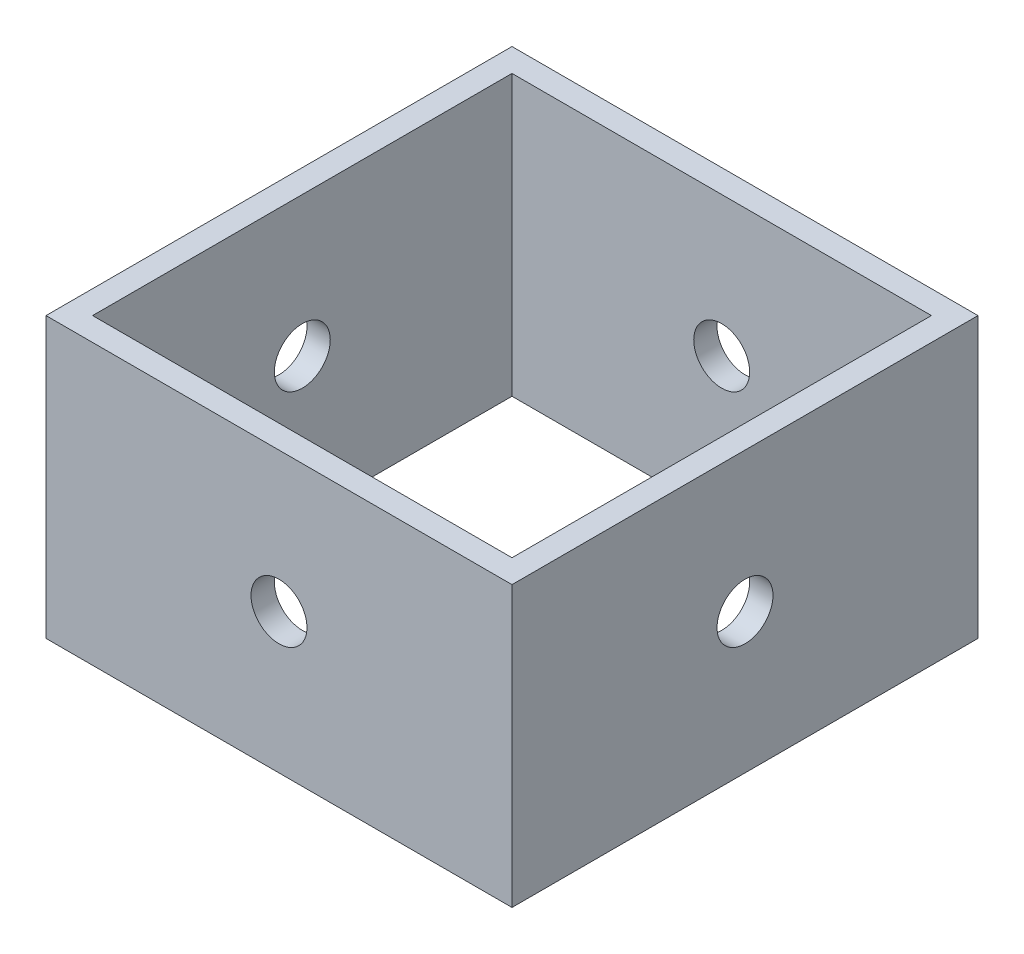
ISO-10303-21;
HEADER;
FILE_DESCRIPTION(('STEP AP214'),'2;1');
FILE_NAME('part.step','',(''),(''),'','','');
FILE_SCHEMA(('AUTOMOTIVE_DESIGN { 1 0 10303 214 1 1 1 1 }'));
ENDSEC;
DATA;
#1=APPLICATION_CONTEXT('core data for automotive mechanical design processes');
#2=APPLICATION_PROTOCOL_DEFINITION('international standard','automotive_design',2000,#1);
#3=PRODUCT_CONTEXT('',#1,'mechanical');
#4=PRODUCT('Part','Part','',(#3));
#5=PRODUCT_RELATED_PRODUCT_CATEGORY('part','',(#4));
#6=PRODUCT_DEFINITION_FORMATION('','',#4);
#7=PRODUCT_DEFINITION_CONTEXT('part definition',#1,'design');
#8=PRODUCT_DEFINITION('design','',#6,#7);
#9=PRODUCT_DEFINITION_SHAPE('','',#8);
#10=(LENGTH_UNIT() NAMED_UNIT(*) SI_UNIT(.MILLI.,.METRE.));
#11=(NAMED_UNIT(*) PLANE_ANGLE_UNIT() SI_UNIT($,.RADIAN.));
#12=(NAMED_UNIT(*) SI_UNIT($,.STERADIAN.) SOLID_ANGLE_UNIT());
#13=UNCERTAINTY_MEASURE_WITH_UNIT(LENGTH_MEASURE(1.E-05),#10,'distance_accuracy_value','');
#14=(GEOMETRIC_REPRESENTATION_CONTEXT(3) GLOBAL_UNCERTAINTY_ASSIGNED_CONTEXT((#13)) GLOBAL_UNIT_ASSIGNED_CONTEXT((#10,
#11,#12)) REPRESENTATION_CONTEXT('',''));
#15=CARTESIAN_POINT('',(0.,0.,0.));
#16=DIRECTION('',(0.,0.,1.));
#17=DIRECTION('',(1.,0.,0.));
#18=AXIS2_PLACEMENT_3D('',#15,#16,#17);
#19=CARTESIAN_POINT('',(0.,15.,0.));
#20=DIRECTION('',(0.,1.,0.));
#21=DIRECTION('',(0.,0.,1.));
#22=AXIS2_PLACEMENT_3D('',#19,#20,#21);
#23=PLANE('',#22);
#24=DIRECTION('',(0.,0.,-1.));
#25=VECTOR('',#24,1.);
#26=CARTESIAN_POINT('',(12.5,15.,-12.5));
#27=LINE('',#26,#25);
#28=CARTESIAN_POINT('',(12.5,15.,12.5));
#29=VERTEX_POINT('',#28);
#30=CARTESIAN_POINT('',(12.5,15.,-12.5));
#31=VERTEX_POINT('',#30);
#32=EDGE_CURVE('E140',#29,#31,#27,.T.);
#33=ORIENTED_EDGE('',*,*,#32,.T.);
#34=DIRECTION('',(-1.,0.,0.));
#35=VECTOR('',#34,1.);
#36=CARTESIAN_POINT('',(-12.5,15.,-12.5));
#37=LINE('',#36,#35);
#38=CARTESIAN_POINT('',(-12.5,15.,-12.5));
#39=VERTEX_POINT('',#38);
#40=EDGE_CURVE('E143',#31,#39,#37,.T.);
#41=ORIENTED_EDGE('',*,*,#40,.T.);
#42=DIRECTION('',(0.,0.,1.));
#43=VECTOR('',#42,1.);
#44=CARTESIAN_POINT('',(-12.5,15.,-12.5));
#45=LINE('',#44,#43);
#46=CARTESIAN_POINT('',(-12.5,15.,12.5));
#47=VERTEX_POINT('',#46);
#48=EDGE_CURVE('E146',#39,#47,#45,.T.);
#49=ORIENTED_EDGE('',*,*,#48,.T.);
#50=DIRECTION('',(1.,0.,0.));
#51=VECTOR('',#50,1.);
#52=CARTESIAN_POINT('',(-12.5,15.,12.5));
#53=LINE('',#52,#51);
#54=EDGE_CURVE('E148',#47,#29,#53,.T.);
#55=ORIENTED_EDGE('',*,*,#54,.T.);
#56=EDGE_LOOP('',(#33,#41,#49,#55));
#57=FACE_BOUND('',#56,.T.);
#58=DIRECTION('',(1.,0.,0.));
#59=VECTOR('',#58,1.);
#60=CARTESIAN_POINT('',(11.2504266533904,15.,11.2504266533904));
#61=LINE('',#60,#59);
#62=CARTESIAN_POINT('',(-11.2504266533904,15.,11.2504266533904));
#63=VERTEX_POINT('',#62);
#64=CARTESIAN_POINT('',(11.2504266533904,15.,11.2504266533904));
#65=VERTEX_POINT('',#64);
#66=EDGE_CURVE('E110',#63,#65,#61,.T.);
#67=ORIENTED_EDGE('',*,*,#66,.F.);
#68=DIRECTION('',(0.,0.,1.));
#69=VECTOR('',#68,1.);
#70=CARTESIAN_POINT('',(-11.2504266533904,15.,-11.2504266533904));
#71=LINE('',#70,#69);
#72=CARTESIAN_POINT('',(-11.2504266533904,15.,-11.2504266533904));
#73=VERTEX_POINT('',#72);
#74=EDGE_CURVE('E102',#73,#63,#71,.T.);
#75=ORIENTED_EDGE('',*,*,#74,.F.);
#76=DIRECTION('',(-1.,0.,0.));
#77=VECTOR('',#76,1.);
#78=CARTESIAN_POINT('',(11.2504266533904,15.,-11.2504266533904));
#79=LINE('',#78,#77);
#80=CARTESIAN_POINT('',(11.2504266533904,15.,-11.2504266533904));
#81=VERTEX_POINT('',#80);
#82=EDGE_CURVE('E124',#81,#73,#79,.T.);
#83=ORIENTED_EDGE('',*,*,#82,.F.);
#84=DIRECTION('',(0.,0.,-1.));
#85=VECTOR('',#84,1.);
#86=CARTESIAN_POINT('',(11.2504266533904,15.,-11.2504266533904));
#87=LINE('',#86,#85);
#88=EDGE_CURVE('E122',#65,#81,#87,.T.);
#89=ORIENTED_EDGE('',*,*,#88,.F.);
#90=EDGE_LOOP('',(#67,#75,#83,#89));
#91=FACE_BOUND('',#90,.T.);
#92=ADVANCED_FACE('F35',(#57,#91),#23,.T.);
#93=CARTESIAN_POINT('',(0.,0.,0.));
#94=DIRECTION('',(0.,1.,0.));
#95=DIRECTION('',(0.,0.,1.));
#96=AXIS2_PLACEMENT_3D('',#93,#94,#95);
#97=PLANE('',#96);
#98=DIRECTION('',(0.,0.,-1.));
#99=VECTOR('',#98,1.);
#100=CARTESIAN_POINT('',(12.5,0.,-12.5));
#101=LINE('',#100,#99);
#102=CARTESIAN_POINT('',(12.5,0.,12.5));
#103=VERTEX_POINT('',#102);
#104=CARTESIAN_POINT('',(12.5,0.,-12.5));
#105=VERTEX_POINT('',#104);
#106=EDGE_CURVE('E118',#103,#105,#101,.T.);
#107=ORIENTED_EDGE('',*,*,#106,.F.);
#108=DIRECTION('',(1.,0.,0.));
#109=VECTOR('',#108,1.);
#110=CARTESIAN_POINT('',(-12.5,0.,12.5));
#111=LINE('',#110,#109);
#112=CARTESIAN_POINT('',(-12.5,0.,12.5));
#113=VERTEX_POINT('',#112);
#114=EDGE_CURVE('E144',#113,#103,#111,.T.);
#115=ORIENTED_EDGE('',*,*,#114,.F.);
#116=DIRECTION('',(0.,0.,1.));
#117=VECTOR('',#116,1.);
#118=CARTESIAN_POINT('',(-12.5,0.,-12.5));
#119=LINE('',#118,#117);
#120=CARTESIAN_POINT('',(-12.5,0.,-12.5));
#121=VERTEX_POINT('',#120);
#122=EDGE_CURVE('E155',#121,#113,#119,.T.);
#123=ORIENTED_EDGE('',*,*,#122,.F.);
#124=DIRECTION('',(-1.,0.,0.));
#125=VECTOR('',#124,1.);
#126=CARTESIAN_POINT('',(-12.5,0.,-12.5));
#127=LINE('',#126,#125);
#128=EDGE_CURVE('E153',#105,#121,#127,.T.);
#129=ORIENTED_EDGE('',*,*,#128,.F.);
#130=EDGE_LOOP('',(#107,#115,#123,#129));
#131=FACE_BOUND('',#130,.T.);
#132=DIRECTION('',(0.,0.,1.));
#133=VECTOR('',#132,1.);
#134=CARTESIAN_POINT('',(-11.2504266533904,0.,-11.2504266533904));
#135=LINE('',#134,#133);
#136=CARTESIAN_POINT('',(-11.2504266533904,0.,-11.2504266533904));
#137=VERTEX_POINT('',#136);
#138=CARTESIAN_POINT('',(-11.2504266533904,0.,11.2504266533904));
#139=VERTEX_POINT('',#138);
#140=EDGE_CURVE('E60',#137,#139,#135,.T.);
#141=ORIENTED_EDGE('',*,*,#140,.T.);
#142=DIRECTION('',(1.,0.,0.));
#143=VECTOR('',#142,1.);
#144=CARTESIAN_POINT('',(11.2504266533904,0.,11.2504266533904));
#145=LINE('',#144,#143);
#146=CARTESIAN_POINT('',(11.2504266533904,0.,11.2504266533904));
#147=VERTEX_POINT('',#146);
#148=EDGE_CURVE('E117',#139,#147,#145,.T.);
#149=ORIENTED_EDGE('',*,*,#148,.T.);
#150=DIRECTION('',(0.,0.,-1.));
#151=VECTOR('',#150,1.);
#152=CARTESIAN_POINT('',(11.2504266533904,0.,-11.2504266533904));
#153=LINE('',#152,#151);
#154=CARTESIAN_POINT('',(11.2504266533904,0.,-11.2504266533904));
#155=VERTEX_POINT('',#154);
#156=EDGE_CURVE('E132',#147,#155,#153,.T.);
#157=ORIENTED_EDGE('',*,*,#156,.T.);
#158=DIRECTION('',(-1.,0.,0.));
#159=VECTOR('',#158,1.);
#160=CARTESIAN_POINT('',(11.2504266533904,0.,-11.2504266533904));
#161=LINE('',#160,#159);
#162=EDGE_CURVE('E111',#155,#137,#161,.T.);
#163=ORIENTED_EDGE('',*,*,#162,.T.);
#164=EDGE_LOOP('',(#141,#149,#157,#163));
#165=FACE_BOUND('',#164,.T.);
#166=ADVANCED_FACE('F201',(#131,#165),#97,.F.);
#167=CARTESIAN_POINT('',(12.5,15.,-12.5));
#168=DIRECTION('',(-1.,0.,0.));
#169=DIRECTION('',(0.,0.,1.));
#170=AXIS2_PLACEMENT_3D('',#167,#168,#169);
#171=PLANE('',#170);
#172=CARTESIAN_POINT('',(12.5,7.5,0.));
#173=DIRECTION('',(1.,0.,0.));
#174=DIRECTION('',(0.,0.,-1.));
#175=AXIS2_PLACEMENT_3D('',#172,#173,#174);
#176=CIRCLE('',#175,1.5);
#177=CARTESIAN_POINT('',(12.5,7.5,-1.5));
#178=VERTEX_POINT('',#177);
#179=EDGE_CURVE('E181',#178,#178,#176,.T.);
#180=ORIENTED_EDGE('',*,*,#179,.F.);
#181=EDGE_LOOP('',(#180));
#182=FACE_BOUND('',#181,.T.);
#183=ORIENTED_EDGE('',*,*,#106,.T.);
#184=DIRECTION('',(0.,-1.,0.));
#185=VECTOR('',#184,1.);
#186=CARTESIAN_POINT('',(12.5,15.,-12.5));
#187=LINE('',#186,#185);
#188=EDGE_CURVE('E11',#31,#105,#187,.T.);
#189=ORIENTED_EDGE('',*,*,#188,.F.);
#190=ORIENTED_EDGE('',*,*,#32,.F.);
#191=DIRECTION('',(0.,-1.,0.));
#192=VECTOR('',#191,1.);
#193=CARTESIAN_POINT('',(12.5,15.,12.5));
#194=LINE('',#193,#192);
#195=EDGE_CURVE('E150',#29,#103,#194,.T.);
#196=ORIENTED_EDGE('',*,*,#195,.T.);
#197=EDGE_LOOP('',(#183,#189,#190,#196));
#198=FACE_BOUND('',#197,.T.);
#199=ADVANCED_FACE('F37',(#182,#198),#171,.F.);
#200=CARTESIAN_POINT('',(-12.5,15.,-12.5));
#201=DIRECTION('',(0.,0.,1.));
#202=DIRECTION('',(1.,0.,0.));
#203=AXIS2_PLACEMENT_3D('',#200,#201,#202);
#204=PLANE('',#203);
#205=CARTESIAN_POINT('',(2.8421709430404E-11,7.50000000003276,-12.5));
#206=DIRECTION('',(0.,0.,-1.));
#207=DIRECTION('',(-1.,0.,0.));
#208=AXIS2_PLACEMENT_3D('',#205,#206,#207);
#209=CIRCLE('',#208,1.5);
#210=CARTESIAN_POINT('',(-1.49999999997158,7.50000000003276,-12.5));
#211=VERTEX_POINT('',#210);
#212=EDGE_CURVE('E171',#211,#211,#209,.T.);
#213=ORIENTED_EDGE('',*,*,#212,.F.);
#214=EDGE_LOOP('',(#213));
#215=FACE_BOUND('',#214,.T.);
#216=ORIENTED_EDGE('',*,*,#128,.T.);
#217=DIRECTION('',(0.,-1.,0.));
#218=VECTOR('',#217,1.);
#219=CARTESIAN_POINT('',(-12.5,15.,-12.5));
#220=LINE('',#219,#218);
#221=EDGE_CURVE('E44',#39,#121,#220,.T.);
#222=ORIENTED_EDGE('',*,*,#221,.F.);
#223=ORIENTED_EDGE('',*,*,#40,.F.);
#224=ORIENTED_EDGE('',*,*,#188,.T.);
#225=EDGE_LOOP('',(#216,#222,#223,#224));
#226=FACE_BOUND('',#225,.T.);
#227=ADVANCED_FACE('F227',(#215,#226),#204,.F.);
#228=CARTESIAN_POINT('',(-12.5,15.,-12.5));
#229=DIRECTION('',(1.,0.,0.));
#230=DIRECTION('',(0.,0.,-1.));
#231=AXIS2_PLACEMENT_3D('',#228,#229,#230);
#232=PLANE('',#231);
#233=CARTESIAN_POINT('',(-12.5,7.5,0.));
#234=DIRECTION('',(1.,0.,0.));
#235=DIRECTION('',(0.,0.,-1.));
#236=AXIS2_PLACEMENT_3D('',#233,#234,#235);
#237=CIRCLE('',#236,1.5);
#238=CARTESIAN_POINT('',(-12.5,7.5,-1.49999999999999));
#239=VERTEX_POINT('',#238);
#240=EDGE_CURVE('E184',#239,#239,#237,.T.);
#241=ORIENTED_EDGE('',*,*,#240,.T.);
#242=EDGE_LOOP('',(#241));
#243=FACE_BOUND('',#242,.T.);
#244=ORIENTED_EDGE('',*,*,#122,.T.);
#245=DIRECTION('',(0.,-1.,0.));
#246=VECTOR('',#245,1.);
#247=CARTESIAN_POINT('',(-12.5,15.,12.5));
#248=LINE('',#247,#246);
#249=EDGE_CURVE('E160',#47,#113,#248,.T.);
#250=ORIENTED_EDGE('',*,*,#249,.F.);
#251=ORIENTED_EDGE('',*,*,#48,.F.);
#252=ORIENTED_EDGE('',*,*,#221,.T.);
#253=EDGE_LOOP('',(#244,#250,#251,#252));
#254=FACE_BOUND('',#253,.T.);
#255=ADVANCED_FACE('F225',(#243,#254),#232,.F.);
#256=CARTESIAN_POINT('',(-12.5,15.,12.5));
#257=DIRECTION('',(0.,0.,-1.));
#258=DIRECTION('',(-1.,0.,0.));
#259=AXIS2_PLACEMENT_3D('',#256,#257,#258);
#260=PLANE('',#259);
#261=CARTESIAN_POINT('',(2.8421709430404E-11,7.50000000003276,12.5));
#262=DIRECTION('',(0.,0.,-1.));
#263=DIRECTION('',(-1.,0.,0.));
#264=AXIS2_PLACEMENT_3D('',#261,#262,#263);
#265=CIRCLE('',#264,1.5);
#266=CARTESIAN_POINT('',(-1.49999999997158,7.50000000003276,12.5));
#267=VERTEX_POINT('',#266);
#268=EDGE_CURVE('E166',#267,#267,#265,.T.);
#269=ORIENTED_EDGE('',*,*,#268,.T.);
#270=EDGE_LOOP('',(#269));
#271=FACE_BOUND('',#270,.T.);
#272=ORIENTED_EDGE('',*,*,#114,.T.);
#273=ORIENTED_EDGE('',*,*,#195,.F.);
#274=ORIENTED_EDGE('',*,*,#54,.F.);
#275=ORIENTED_EDGE('',*,*,#249,.T.);
#276=EDGE_LOOP('',(#272,#273,#274,#275));
#277=FACE_BOUND('',#276,.T.);
#278=ADVANCED_FACE('F222',(#271,#277),#260,.F.);
#279=CARTESIAN_POINT('',(-11.2504266533904,15.,-11.2504266533904));
#280=DIRECTION('',(1.,0.,0.));
#281=DIRECTION('',(0.,0.,-1.));
#282=AXIS2_PLACEMENT_3D('',#279,#280,#281);
#283=PLANE('',#282);
#284=CARTESIAN_POINT('',(-11.2504266533904,7.5,0.));
#285=DIRECTION('',(1.,0.,0.));
#286=DIRECTION('',(0.,0.,-1.));
#287=AXIS2_PLACEMENT_3D('',#284,#285,#286);
#288=CIRCLE('',#287,1.5);
#289=CARTESIAN_POINT('',(-11.2504266533904,7.5,-1.49999999999999));
#290=VERTEX_POINT('',#289);
#291=EDGE_CURVE('E176',#290,#290,#288,.T.);
#292=ORIENTED_EDGE('',*,*,#291,.F.);
#293=EDGE_LOOP('',(#292));
#294=FACE_BOUND('',#293,.T.);
#295=ORIENTED_EDGE('',*,*,#140,.F.);
#296=DIRECTION('',(0.,-1.,0.));
#297=VECTOR('',#296,1.);
#298=CARTESIAN_POINT('',(-11.2504266533904,15.,-11.2504266533904));
#299=LINE('',#298,#297);
#300=EDGE_CURVE('E106',#73,#137,#299,.T.);
#301=ORIENTED_EDGE('',*,*,#300,.F.);
#302=ORIENTED_EDGE('',*,*,#74,.T.);
#303=DIRECTION('',(0.,-1.,0.));
#304=VECTOR('',#303,1.);
#305=CARTESIAN_POINT('',(-11.2504266533904,15.,11.2504266533904));
#306=LINE('',#305,#304);
#307=EDGE_CURVE('E105',#63,#139,#306,.T.);
#308=ORIENTED_EDGE('',*,*,#307,.T.);
#309=EDGE_LOOP('',(#295,#301,#302,#308));
#310=FACE_BOUND('',#309,.T.);
#311=ADVANCED_FACE('F104',(#294,#310),#283,.T.);
#312=CARTESIAN_POINT('',(11.2504266533904,15.,11.2504266533904));
#313=DIRECTION('',(0.,0.,-1.));
#314=DIRECTION('',(-1.,0.,0.));
#315=AXIS2_PLACEMENT_3D('',#312,#313,#314);
#316=PLANE('',#315);
#317=CARTESIAN_POINT('',(2.8421709430404E-11,7.50000000003276,11.2504266533904));
#318=DIRECTION('',(0.,0.,-1.));
#319=DIRECTION('',(-1.,0.,0.));
#320=AXIS2_PLACEMENT_3D('',#317,#318,#319);
#321=CIRCLE('',#320,1.5);
#322=CARTESIAN_POINT('',(-1.49999999997158,7.50000000003276,11.2504266533904));
#323=VERTEX_POINT('',#322);
#324=EDGE_CURVE('E130',#323,#323,#321,.T.);
#325=ORIENTED_EDGE('',*,*,#324,.F.);
#326=EDGE_LOOP('',(#325));
#327=FACE_BOUND('',#326,.T.);
#328=ORIENTED_EDGE('',*,*,#148,.F.);
#329=ORIENTED_EDGE('',*,*,#307,.F.);
#330=ORIENTED_EDGE('',*,*,#66,.T.);
#331=DIRECTION('',(0.,-1.,0.));
#332=VECTOR('',#331,1.);
#333=CARTESIAN_POINT('',(11.2504266533904,15.,11.2504266533904));
#334=LINE('',#333,#332);
#335=EDGE_CURVE('E119',#65,#147,#334,.T.);
#336=ORIENTED_EDGE('',*,*,#335,.T.);
#337=EDGE_LOOP('',(#328,#329,#330,#336));
#338=FACE_BOUND('',#337,.T.);
#339=ADVANCED_FACE('F114',(#327,#338),#316,.T.);
#340=CARTESIAN_POINT('',(11.2504266533904,15.,-11.2504266533904));
#341=DIRECTION('',(-1.,0.,0.));
#342=DIRECTION('',(0.,0.,1.));
#343=AXIS2_PLACEMENT_3D('',#340,#341,#342);
#344=PLANE('',#343);
#345=CARTESIAN_POINT('',(11.2504266533904,7.5,0.));
#346=DIRECTION('',(-1.,0.,0.));
#347=DIRECTION('',(0.,0.,1.));
#348=AXIS2_PLACEMENT_3D('',#345,#346,#347);
#349=CIRCLE('',#348,1.5);
#350=CARTESIAN_POINT('',(11.2504266533904,7.5,1.50000000000001));
#351=VERTEX_POINT('',#350);
#352=EDGE_CURVE('E39',#351,#351,#349,.T.);
#353=ORIENTED_EDGE('',*,*,#352,.F.);
#354=EDGE_LOOP('',(#353));
#355=FACE_BOUND('',#354,.T.);
#356=ORIENTED_EDGE('',*,*,#156,.F.);
#357=ORIENTED_EDGE('',*,*,#335,.F.);
#358=ORIENTED_EDGE('',*,*,#88,.T.);
#359=DIRECTION('',(0.,-1.,0.));
#360=VECTOR('',#359,1.);
#361=CARTESIAN_POINT('',(11.2504266533904,15.,-11.2504266533904));
#362=LINE('',#361,#360);
#363=EDGE_CURVE('E52',#81,#155,#362,.T.);
#364=ORIENTED_EDGE('',*,*,#363,.T.);
#365=EDGE_LOOP('',(#356,#357,#358,#364));
#366=FACE_BOUND('',#365,.T.);
#367=ADVANCED_FACE('F194',(#355,#366),#344,.T.);
#368=CARTESIAN_POINT('',(11.2504266533904,15.,-11.2504266533904));
#369=DIRECTION('',(0.,0.,1.));
#370=DIRECTION('',(1.,0.,0.));
#371=AXIS2_PLACEMENT_3D('',#368,#369,#370);
#372=PLANE('',#371);
#373=CARTESIAN_POINT('',(2.8421709430404E-11,7.50000000003276,-11.2504266533904));
#374=DIRECTION('',(0.,0.,1.));
#375=DIRECTION('',(1.,0.,0.));
#376=AXIS2_PLACEMENT_3D('',#373,#374,#375);
#377=CIRCLE('',#376,1.5);
#378=CARTESIAN_POINT('',(1.50000000002842,7.50000000003276,-11.2504266533904));
#379=VERTEX_POINT('',#378);
#380=EDGE_CURVE('E164',#379,#379,#377,.T.);
#381=ORIENTED_EDGE('',*,*,#380,.F.);
#382=EDGE_LOOP('',(#381));
#383=FACE_BOUND('',#382,.T.);
#384=ORIENTED_EDGE('',*,*,#162,.F.);
#385=ORIENTED_EDGE('',*,*,#363,.F.);
#386=ORIENTED_EDGE('',*,*,#82,.T.);
#387=ORIENTED_EDGE('',*,*,#300,.T.);
#388=EDGE_LOOP('',(#384,#385,#386,#387));
#389=FACE_BOUND('',#388,.T.);
#390=ADVANCED_FACE('F197',(#383,#389),#372,.T.);
#391=CARTESIAN_POINT('',(2.8421709430404E-11,7.50000000003276,12.5));
#392=DIRECTION('',(0.,0.,-1.));
#393=DIRECTION('',(-1.,0.,0.));
#394=AXIS2_PLACEMENT_3D('',#391,#392,#393);
#395=CYLINDRICAL_SURFACE('',#394,1.5);
#396=ORIENTED_EDGE('',*,*,#380,.T.);
#397=EDGE_LOOP('',(#396));
#398=FACE_BOUND('',#397,.T.);
#399=ORIENTED_EDGE('',*,*,#212,.T.);
#400=EDGE_LOOP('',(#399));
#401=FACE_BOUND('',#400,.T.);
#402=ADVANCED_FACE('F203',(#398,#401),#395,.F.);
#403=ORIENTED_EDGE('',*,*,#324,.T.);
#404=EDGE_LOOP('',(#403));
#405=FACE_BOUND('',#404,.T.);
#406=ORIENTED_EDGE('',*,*,#268,.F.);
#407=EDGE_LOOP('',(#406));
#408=FACE_BOUND('',#407,.T.);
#409=ADVANCED_FACE('F209',(#405,#408),#395,.F.);
#410=CARTESIAN_POINT('',(-12.5,7.5,0.));
#411=DIRECTION('',(1.,0.,0.));
#412=DIRECTION('',(0.,0.,-1.));
#413=AXIS2_PLACEMENT_3D('',#410,#411,#412);
#414=CYLINDRICAL_SURFACE('',#413,1.5);
#415=ORIENTED_EDGE('',*,*,#352,.T.);
#416=EDGE_LOOP('',(#415));
#417=FACE_BOUND('',#416,.T.);
#418=ORIENTED_EDGE('',*,*,#179,.T.);
#419=EDGE_LOOP('',(#418));
#420=FACE_BOUND('',#419,.T.);
#421=ADVANCED_FACE('F191',(#417,#420),#414,.F.);
#422=ORIENTED_EDGE('',*,*,#291,.T.);
#423=EDGE_LOOP('',(#422));
#424=FACE_BOUND('',#423,.T.);
#425=ORIENTED_EDGE('',*,*,#240,.F.);
#426=EDGE_LOOP('',(#425));
#427=FACE_BOUND('',#426,.T.);
#428=ADVANCED_FACE('F254',(#424,#427),#414,.F.);
#429=CLOSED_SHELL('',(#92,#166,#199,#227,#255,#278,#311,#339,#367,#390,#402,#409,#421,#428));
#430=MANIFOLD_SOLID_BREP('B2',#429);
#431=ADVANCED_BREP_SHAPE_REPRESENTATION('',(#18,#430),#14);
#432=SHAPE_DEFINITION_REPRESENTATION(#9,#431);
ENDSEC;
END-ISO-10303-21;
